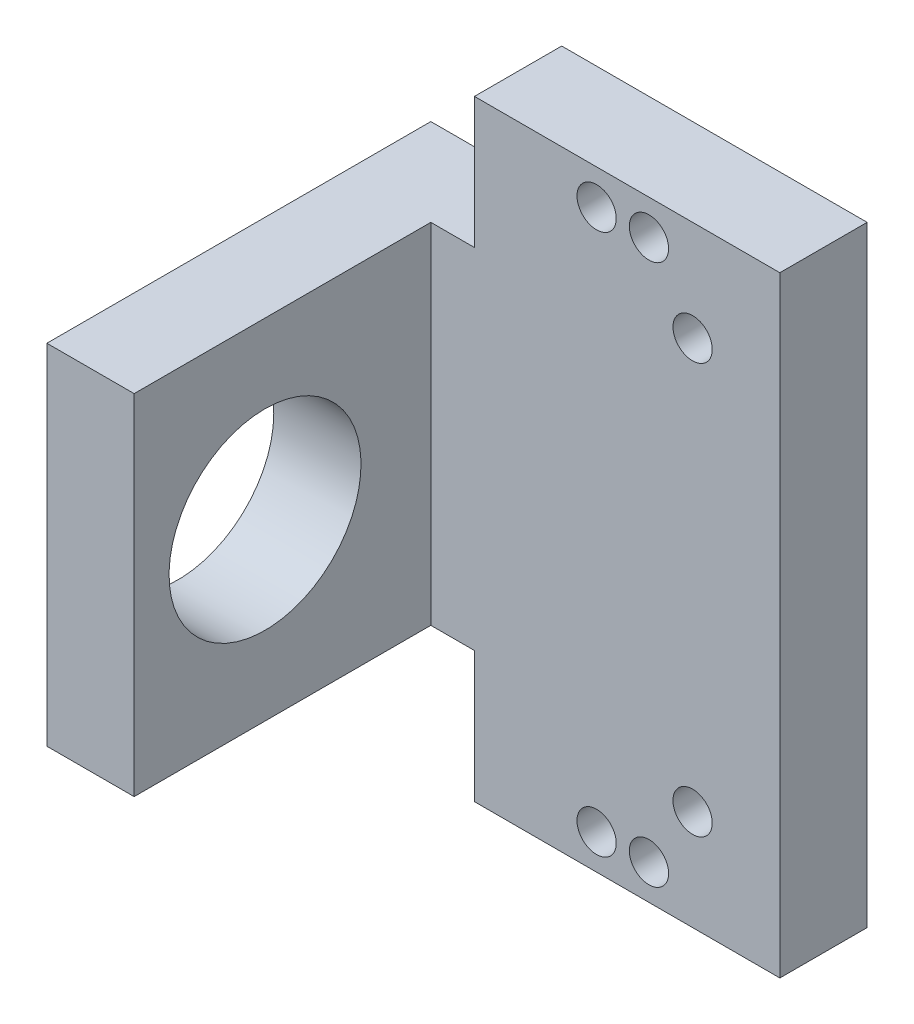
ISO-10303-21;
HEADER;
FILE_DESCRIPTION(('STEP AP214'),'2;1');
FILE_NAME('part.step','',(''),(''),'','','');
FILE_SCHEMA(('AUTOMOTIVE_DESIGN { 1 0 10303 214 1 1 1 1 }'));
ENDSEC;
DATA;
#1=APPLICATION_CONTEXT('core data for automotive mechanical design processes');
#2=APPLICATION_PROTOCOL_DEFINITION('international standard','automotive_design',2000,#1);
#3=PRODUCT_CONTEXT('',#1,'mechanical');
#4=PRODUCT('Part','Part','',(#3));
#5=PRODUCT_RELATED_PRODUCT_CATEGORY('part','',(#4));
#6=PRODUCT_DEFINITION_FORMATION('','',#4);
#7=PRODUCT_DEFINITION_CONTEXT('part definition',#1,'design');
#8=PRODUCT_DEFINITION('design','',#6,#7);
#9=PRODUCT_DEFINITION_SHAPE('','',#8);
#10=(LENGTH_UNIT() NAMED_UNIT(*) SI_UNIT(.MILLI.,.METRE.));
#11=(NAMED_UNIT(*) PLANE_ANGLE_UNIT() SI_UNIT($,.RADIAN.));
#12=(NAMED_UNIT(*) SI_UNIT($,.STERADIAN.) SOLID_ANGLE_UNIT());
#13=UNCERTAINTY_MEASURE_WITH_UNIT(LENGTH_MEASURE(1.E-05),#10,'distance_accuracy_value','');
#14=(GEOMETRIC_REPRESENTATION_CONTEXT(3) GLOBAL_UNCERTAINTY_ASSIGNED_CONTEXT((#13)) GLOBAL_UNIT_ASSIGNED_CONTEXT((#10,
#11,#12)) REPRESENTATION_CONTEXT('',''));
#15=CARTESIAN_POINT('',(0.,0.,0.));
#16=DIRECTION('',(0.,0.,1.));
#17=DIRECTION('',(1.,0.,0.));
#18=AXIS2_PLACEMENT_3D('',#15,#16,#17);
#19=CARTESIAN_POINT('',(0.,70.,10.));
#20=DIRECTION('',(0.,0.,-1.));
#21=DIRECTION('',(-1.,0.,0.));
#22=AXIS2_PLACEMENT_3D('',#19,#20,#21);
#23=PLANE('',#22);
#24=CARTESIAN_POINT('',(29.,66.,10.));
#25=DIRECTION('',(0.,0.,1.));
#26=DIRECTION('',(-1.,0.,0.));
#27=AXIS2_PLACEMENT_3D('',#24,#25,#26);
#28=CIRCLE('',#27,2.25);
#29=CARTESIAN_POINT('',(26.75,66.,10.));
#30=VERTEX_POINT('',#29);
#31=EDGE_CURVE('E168',#30,#30,#28,.T.);
#32=ORIENTED_EDGE('',*,*,#31,.F.);
#33=EDGE_LOOP('',(#32));
#34=FACE_BOUND('',#33,.T.);
#35=CARTESIAN_POINT('',(29.,4.,10.));
#36=DIRECTION('',(0.,0.,1.));
#37=DIRECTION('',(1.,0.,0.));
#38=AXIS2_PLACEMENT_3D('',#35,#36,#37);
#39=CIRCLE('',#38,2.25);
#40=CARTESIAN_POINT('',(31.25,4.,10.));
#41=VERTEX_POINT('',#40);
#42=EDGE_CURVE('E172',#41,#41,#39,.T.);
#43=ORIENTED_EDGE('',*,*,#42,.F.);
#44=EDGE_LOOP('',(#43));
#45=FACE_BOUND('',#44,.T.);
#46=CARTESIAN_POINT('',(35.,4.,10.));
#47=DIRECTION('',(0.,0.,1.));
#48=DIRECTION('',(-1.,0.,0.));
#49=AXIS2_PLACEMENT_3D('',#46,#47,#48);
#50=CIRCLE('',#49,2.25);
#51=CARTESIAN_POINT('',(32.75,4.,10.));
#52=VERTEX_POINT('',#51);
#53=EDGE_CURVE('E178',#52,#52,#50,.T.);
#54=ORIENTED_EDGE('',*,*,#53,.F.);
#55=EDGE_LOOP('',(#54));
#56=FACE_BOUND('',#55,.T.);
#57=CARTESIAN_POINT('',(35.,66.,10.));
#58=DIRECTION('',(0.,0.,1.));
#59=DIRECTION('',(1.,0.,0.));
#60=AXIS2_PLACEMENT_3D('',#57,#58,#59);
#61=CIRCLE('',#60,2.25);
#62=CARTESIAN_POINT('',(37.25,66.,10.));
#63=VERTEX_POINT('',#62);
#64=EDGE_CURVE('E184',#63,#63,#61,.T.);
#65=ORIENTED_EDGE('',*,*,#64,.F.);
#66=EDGE_LOOP('',(#65));
#67=FACE_BOUND('',#66,.T.);
#68=CARTESIAN_POINT('',(40.,58.5,10.));
#69=DIRECTION('',(0.,0.,1.));
#70=DIRECTION('',(-1.,0.,0.));
#71=AXIS2_PLACEMENT_3D('',#68,#69,#70);
#72=CIRCLE('',#71,2.25);
#73=CARTESIAN_POINT('',(37.75,58.5,10.));
#74=VERTEX_POINT('',#73);
#75=EDGE_CURVE('E190',#74,#74,#72,.T.);
#76=ORIENTED_EDGE('',*,*,#75,.F.);
#77=EDGE_LOOP('',(#76));
#78=FACE_BOUND('',#77,.T.);
#79=CARTESIAN_POINT('',(40.,11.5,10.));
#80=DIRECTION('',(0.,0.,1.));
#81=DIRECTION('',(1.,0.,0.));
#82=AXIS2_PLACEMENT_3D('',#79,#80,#81);
#83=CIRCLE('',#82,2.25);
#84=CARTESIAN_POINT('',(42.25,11.5,10.));
#85=VERTEX_POINT('',#84);
#86=EDGE_CURVE('E196',#85,#85,#83,.T.);
#87=ORIENTED_EDGE('',*,*,#86,.F.);
#88=EDGE_LOOP('',(#87));
#89=FACE_BOUND('',#88,.T.);
#90=DIRECTION('',(0.,1.,0.));
#91=VECTOR('',#90,1.);
#92=CARTESIAN_POINT('',(15.,55.,10.));
#93=LINE('',#92,#91);
#94=CARTESIAN_POINT('',(15.,55.,10.));
#95=VERTEX_POINT('',#94);
#96=CARTESIAN_POINT('',(15.,70.,10.));
#97=VERTEX_POINT('',#96);
#98=EDGE_CURVE('E137',#95,#97,#93,.T.);
#99=ORIENTED_EDGE('',*,*,#98,.F.);
#100=DIRECTION('',(1.,0.,0.));
#101=VECTOR('',#100,1.);
#102=CARTESIAN_POINT('',(0.,55.,10.));
#103=LINE('',#102,#101);
#104=CARTESIAN_POINT('',(10.,55.,10.));
#105=VERTEX_POINT('',#104);
#106=EDGE_CURVE('E120',#105,#95,#103,.T.);
#107=ORIENTED_EDGE('',*,*,#106,.F.);
#108=DIRECTION('',(0.,1.,0.));
#109=VECTOR('',#108,1.);
#110=CARTESIAN_POINT('',(10.,70.,10.));
#111=LINE('',#110,#109);
#112=CARTESIAN_POINT('',(10.,15.,10.));
#113=VERTEX_POINT('',#112);
#114=EDGE_CURVE('E210',#113,#105,#111,.T.);
#115=ORIENTED_EDGE('',*,*,#114,.F.);
#116=DIRECTION('',(-1.,0.,0.));
#117=VECTOR('',#116,1.);
#118=CARTESIAN_POINT('',(0.,15.,10.));
#119=LINE('',#118,#117);
#120=CARTESIAN_POINT('',(15.,15.,10.));
#121=VERTEX_POINT('',#120);
#122=EDGE_CURVE('E148',#121,#113,#119,.T.);
#123=ORIENTED_EDGE('',*,*,#122,.F.);
#124=DIRECTION('',(0.,1.,0.));
#125=VECTOR('',#124,1.);
#126=CARTESIAN_POINT('',(15.,15.,10.));
#127=LINE('',#126,#125);
#128=CARTESIAN_POINT('',(15.,0.,10.));
#129=VERTEX_POINT('',#128);
#130=EDGE_CURVE('E142',#129,#121,#127,.T.);
#131=ORIENTED_EDGE('',*,*,#130,.F.);
#132=DIRECTION('',(1.,0.,0.));
#133=VECTOR('',#132,1.);
#134=CARTESIAN_POINT('',(0.,0.,10.));
#135=LINE('',#134,#133);
#136=CARTESIAN_POINT('',(50.,0.,10.));
#137=VERTEX_POINT('',#136);
#138=EDGE_CURVE('E38',#129,#137,#135,.T.);
#139=ORIENTED_EDGE('',*,*,#138,.T.);
#140=DIRECTION('',(0.,1.,0.));
#141=VECTOR('',#140,1.);
#142=CARTESIAN_POINT('',(50.,0.,10.));
#143=LINE('',#142,#141);
#144=CARTESIAN_POINT('',(50.,70.,10.));
#145=VERTEX_POINT('',#144);
#146=EDGE_CURVE('E224',#137,#145,#143,.T.);
#147=ORIENTED_EDGE('',*,*,#146,.T.);
#148=DIRECTION('',(-1.,0.,0.));
#149=VECTOR('',#148,1.);
#150=CARTESIAN_POINT('',(0.,70.,10.));
#151=LINE('',#150,#149);
#152=EDGE_CURVE('E221',#145,#97,#151,.T.);
#153=ORIENTED_EDGE('',*,*,#152,.T.);
#154=EDGE_LOOP('',(#99,#107,#115,#123,#131,#139,#147,#153));
#155=FACE_BOUND('',#154,.T.);
#156=ADVANCED_FACE('F34',(#34,#45,#56,#67,#78,#89,#155),#23,.F.);
#157=CARTESIAN_POINT('',(0.,0.,10.));
#158=DIRECTION('',(1.,0.,0.));
#159=DIRECTION('',(0.,0.,-1.));
#160=AXIS2_PLACEMENT_3D('',#157,#158,#159);
#161=PLANE('',#160);
#162=CARTESIAN_POINT('',(0.,35.,29.));
#163=DIRECTION('',(1.,0.,0.));
#164=DIRECTION('',(0.,0.,-1.));
#165=AXIS2_PLACEMENT_3D('',#162,#163,#164);
#166=CIRCLE('',#165,11.);
#167=CARTESIAN_POINT('',(0.,35.,18.));
#168=VERTEX_POINT('',#167);
#169=EDGE_CURVE('E207',#168,#168,#166,.T.);
#170=ORIENTED_EDGE('',*,*,#169,.T.);
#171=EDGE_LOOP('',(#170));
#172=FACE_BOUND('',#171,.T.);
#173=DIRECTION('',(0.,0.,-1.));
#174=VECTOR('',#173,1.);
#175=CARTESIAN_POINT('',(0.,55.,44.));
#176=LINE('',#175,#174);
#177=CARTESIAN_POINT('',(0.,55.,44.));
#178=VERTEX_POINT('',#177);
#179=CARTESIAN_POINT('',(0.,55.,0.));
#180=VERTEX_POINT('',#179);
#181=EDGE_CURVE('E52',#178,#180,#176,.T.);
#182=ORIENTED_EDGE('',*,*,#181,.T.);
#183=DIRECTION('',(0.,-1.,0.));
#184=VECTOR('',#183,1.);
#185=CARTESIAN_POINT('',(0.,0.,0.));
#186=LINE('',#185,#184);
#187=CARTESIAN_POINT('',(0.,15.,0.));
#188=VERTEX_POINT('',#187);
#189=EDGE_CURVE('E136',#180,#188,#186,.T.);
#190=ORIENTED_EDGE('',*,*,#189,.T.);
#191=DIRECTION('',(0.,0.,1.));
#192=VECTOR('',#191,1.);
#193=CARTESIAN_POINT('',(0.,15.,44.));
#194=LINE('',#193,#192);
#195=CARTESIAN_POINT('',(0.,15.,44.));
#196=VERTEX_POINT('',#195);
#197=EDGE_CURVE('E162',#188,#196,#194,.T.);
#198=ORIENTED_EDGE('',*,*,#197,.T.);
#199=DIRECTION('',(0.,-1.,0.));
#200=VECTOR('',#199,1.);
#201=CARTESIAN_POINT('',(0.,70.,44.));
#202=LINE('',#201,#200);
#203=EDGE_CURVE('E211',#178,#196,#202,.T.);
#204=ORIENTED_EDGE('',*,*,#203,.F.);
#205=EDGE_LOOP('',(#182,#190,#198,#204));
#206=FACE_BOUND('',#205,.T.);
#207=ADVANCED_FACE('F36',(#172,#206),#161,.F.);
#208=CARTESIAN_POINT('',(0.,0.,10.));
#209=DIRECTION('',(0.,1.,0.));
#210=DIRECTION('',(0.,0.,1.));
#211=AXIS2_PLACEMENT_3D('',#208,#209,#210);
#212=PLANE('',#211);
#213=ORIENTED_EDGE('',*,*,#138,.F.);
#214=DIRECTION('',(0.,0.,1.));
#215=VECTOR('',#214,1.);
#216=CARTESIAN_POINT('',(15.,0.,0.));
#217=LINE('',#216,#215);
#218=CARTESIAN_POINT('',(15.,0.,0.));
#219=VERTEX_POINT('',#218);
#220=EDGE_CURVE('E150',#219,#129,#217,.T.);
#221=ORIENTED_EDGE('',*,*,#220,.F.);
#222=DIRECTION('',(1.,0.,0.));
#223=VECTOR('',#222,1.);
#224=CARTESIAN_POINT('',(0.,0.,0.));
#225=LINE('',#224,#223);
#226=CARTESIAN_POINT('',(50.,0.,0.));
#227=VERTEX_POINT('',#226);
#228=EDGE_CURVE('E229',#219,#227,#225,.T.);
#229=ORIENTED_EDGE('',*,*,#228,.T.);
#230=DIRECTION('',(0.,0.,-1.));
#231=VECTOR('',#230,1.);
#232=CARTESIAN_POINT('',(50.,0.,10.));
#233=LINE('',#232,#231);
#234=EDGE_CURVE('E11',#137,#227,#233,.T.);
#235=ORIENTED_EDGE('',*,*,#234,.F.);
#236=EDGE_LOOP('',(#213,#221,#229,#235));
#237=FACE_BOUND('',#236,.T.);
#238=ADVANCED_FACE('F247',(#237),#212,.F.);
#239=CARTESIAN_POINT('',(50.,0.,10.));
#240=DIRECTION('',(-1.,0.,0.));
#241=DIRECTION('',(0.,0.,1.));
#242=AXIS2_PLACEMENT_3D('',#239,#240,#241);
#243=PLANE('',#242);
#244=DIRECTION('',(0.,1.,0.));
#245=VECTOR('',#244,1.);
#246=CARTESIAN_POINT('',(50.,0.,0.));
#247=LINE('',#246,#245);
#248=CARTESIAN_POINT('',(50.,70.,0.));
#249=VERTEX_POINT('',#248);
#250=EDGE_CURVE('E231',#227,#249,#247,.T.);
#251=ORIENTED_EDGE('',*,*,#250,.T.);
#252=DIRECTION('',(0.,0.,-1.));
#253=VECTOR('',#252,1.);
#254=CARTESIAN_POINT('',(50.,70.,10.));
#255=LINE('',#254,#253);
#256=EDGE_CURVE('E44',#145,#249,#255,.T.);
#257=ORIENTED_EDGE('',*,*,#256,.F.);
#258=ORIENTED_EDGE('',*,*,#146,.F.);
#259=ORIENTED_EDGE('',*,*,#234,.T.);
#260=EDGE_LOOP('',(#251,#257,#258,#259));
#261=FACE_BOUND('',#260,.T.);
#262=ADVANCED_FACE('F243',(#261),#243,.F.);
#263=CARTESIAN_POINT('',(0.,70.,10.));
#264=DIRECTION('',(0.,-1.,0.));
#265=DIRECTION('',(0.,0.,-1.));
#266=AXIS2_PLACEMENT_3D('',#263,#264,#265);
#267=PLANE('',#266);
#268=DIRECTION('',(-1.,0.,0.));
#269=VECTOR('',#268,1.);
#270=CARTESIAN_POINT('',(0.,70.,0.));
#271=LINE('',#270,#269);
#272=CARTESIAN_POINT('',(15.,70.,0.));
#273=VERTEX_POINT('',#272);
#274=EDGE_CURVE('E233',#249,#273,#271,.T.);
#275=ORIENTED_EDGE('',*,*,#274,.T.);
#276=DIRECTION('',(0.,0.,1.));
#277=VECTOR('',#276,1.);
#278=CARTESIAN_POINT('',(15.,70.,0.));
#279=LINE('',#278,#277);
#280=EDGE_CURVE('E123',#273,#97,#279,.T.);
#281=ORIENTED_EDGE('',*,*,#280,.T.);
#282=ORIENTED_EDGE('',*,*,#152,.F.);
#283=ORIENTED_EDGE('',*,*,#256,.T.);
#284=EDGE_LOOP('',(#275,#281,#282,#283));
#285=FACE_BOUND('',#284,.T.);
#286=ADVANCED_FACE('F238',(#285),#267,.F.);
#287=CARTESIAN_POINT('',(0.,70.,0.));
#288=DIRECTION('',(0.,0.,-1.));
#289=DIRECTION('',(-1.,0.,0.));
#290=AXIS2_PLACEMENT_3D('',#287,#288,#289);
#291=PLANE('',#290);
#292=DIRECTION('',(1.,0.,0.));
#293=VECTOR('',#292,1.);
#294=CARTESIAN_POINT('',(0.,55.,0.));
#295=LINE('',#294,#293);
#296=CARTESIAN_POINT('',(15.,55.,0.));
#297=VERTEX_POINT('',#296);
#298=EDGE_CURVE('E118',#180,#297,#295,.T.);
#299=ORIENTED_EDGE('',*,*,#298,.T.);
#300=DIRECTION('',(0.,1.,0.));
#301=VECTOR('',#300,1.);
#302=CARTESIAN_POINT('',(15.,55.,0.));
#303=LINE('',#302,#301);
#304=EDGE_CURVE('E124',#297,#273,#303,.T.);
#305=ORIENTED_EDGE('',*,*,#304,.T.);
#306=ORIENTED_EDGE('',*,*,#274,.F.);
#307=ORIENTED_EDGE('',*,*,#250,.F.);
#308=ORIENTED_EDGE('',*,*,#228,.F.);
#309=DIRECTION('',(0.,1.,0.));
#310=VECTOR('',#309,1.);
#311=CARTESIAN_POINT('',(15.,15.,0.));
#312=LINE('',#311,#310);
#313=CARTESIAN_POINT('',(15.,15.,0.));
#314=VERTEX_POINT('',#313);
#315=EDGE_CURVE('E144',#219,#314,#312,.T.);
#316=ORIENTED_EDGE('',*,*,#315,.T.);
#317=DIRECTION('',(-1.,0.,0.));
#318=VECTOR('',#317,1.);
#319=CARTESIAN_POINT('',(0.,15.,0.));
#320=LINE('',#319,#318);
#321=EDGE_CURVE('E147',#314,#188,#320,.T.);
#322=ORIENTED_EDGE('',*,*,#321,.T.);
#323=ORIENTED_EDGE('',*,*,#189,.F.);
#324=EDGE_LOOP('',(#299,#305,#306,#307,#308,#316,#322,#323));
#325=FACE_BOUND('',#324,.T.);
#326=CARTESIAN_POINT('',(29.,66.,0.));
#327=DIRECTION('',(0.,0.,1.));
#328=DIRECTION('',(-1.,0.,0.));
#329=AXIS2_PLACEMENT_3D('',#326,#327,#328);
#330=CIRCLE('',#329,2.25);
#331=CARTESIAN_POINT('',(26.75,66.,0.));
#332=VERTEX_POINT('',#331);
#333=EDGE_CURVE('E169',#332,#332,#330,.T.);
#334=ORIENTED_EDGE('',*,*,#333,.T.);
#335=EDGE_LOOP('',(#334));
#336=FACE_BOUND('',#335,.T.);
#337=CARTESIAN_POINT('',(29.,4.,0.));
#338=DIRECTION('',(0.,0.,1.));
#339=DIRECTION('',(1.,0.,0.));
#340=AXIS2_PLACEMENT_3D('',#337,#338,#339);
#341=CIRCLE('',#340,2.25);
#342=CARTESIAN_POINT('',(31.25,4.,0.));
#343=VERTEX_POINT('',#342);
#344=EDGE_CURVE('E175',#343,#343,#341,.T.);
#345=ORIENTED_EDGE('',*,*,#344,.T.);
#346=EDGE_LOOP('',(#345));
#347=FACE_BOUND('',#346,.T.);
#348=CARTESIAN_POINT('',(35.,4.,0.));
#349=DIRECTION('',(0.,0.,1.));
#350=DIRECTION('',(-1.,0.,0.));
#351=AXIS2_PLACEMENT_3D('',#348,#349,#350);
#352=CIRCLE('',#351,2.25);
#353=CARTESIAN_POINT('',(32.75,4.,0.));
#354=VERTEX_POINT('',#353);
#355=EDGE_CURVE('E181',#354,#354,#352,.T.);
#356=ORIENTED_EDGE('',*,*,#355,.T.);
#357=EDGE_LOOP('',(#356));
#358=FACE_BOUND('',#357,.T.);
#359=CARTESIAN_POINT('',(35.,66.,0.));
#360=DIRECTION('',(0.,0.,1.));
#361=DIRECTION('',(1.,0.,0.));
#362=AXIS2_PLACEMENT_3D('',#359,#360,#361);
#363=CIRCLE('',#362,2.25);
#364=CARTESIAN_POINT('',(37.25,66.,0.));
#365=VERTEX_POINT('',#364);
#366=EDGE_CURVE('E187',#365,#365,#363,.T.);
#367=ORIENTED_EDGE('',*,*,#366,.T.);
#368=EDGE_LOOP('',(#367));
#369=FACE_BOUND('',#368,.T.);
#370=CARTESIAN_POINT('',(40.,58.5,0.));
#371=DIRECTION('',(0.,0.,1.));
#372=DIRECTION('',(-1.,0.,0.));
#373=AXIS2_PLACEMENT_3D('',#370,#371,#372);
#374=CIRCLE('',#373,2.25);
#375=CARTESIAN_POINT('',(37.75,58.5,0.));
#376=VERTEX_POINT('',#375);
#377=EDGE_CURVE('E193',#376,#376,#374,.T.);
#378=ORIENTED_EDGE('',*,*,#377,.T.);
#379=EDGE_LOOP('',(#378));
#380=FACE_BOUND('',#379,.T.);
#381=CARTESIAN_POINT('',(40.,11.5,0.));
#382=DIRECTION('',(0.,0.,1.));
#383=DIRECTION('',(1.,0.,0.));
#384=AXIS2_PLACEMENT_3D('',#381,#382,#383);
#385=CIRCLE('',#384,2.25);
#386=CARTESIAN_POINT('',(42.25,11.5,0.));
#387=VERTEX_POINT('',#386);
#388=EDGE_CURVE('E199',#387,#387,#385,.T.);
#389=ORIENTED_EDGE('',*,*,#388,.T.);
#390=EDGE_LOOP('',(#389));
#391=FACE_BOUND('',#390,.T.);
#392=ADVANCED_FACE('F133',(#325,#336,#347,#358,#369,#380,#391),#291,.T.);
#393=CARTESIAN_POINT('',(10.,70.,44.));
#394=DIRECTION('',(-1.,0.,0.));
#395=DIRECTION('',(0.,-1.,0.));
#396=AXIS2_PLACEMENT_3D('',#393,#394,#395);
#397=PLANE('',#396);
#398=CARTESIAN_POINT('',(10.,35.,29.));
#399=DIRECTION('',(1.,0.,0.));
#400=DIRECTION('',(0.,1.,0.));
#401=AXIS2_PLACEMENT_3D('',#398,#399,#400);
#402=CIRCLE('',#401,11.);
#403=CARTESIAN_POINT('',(10.,46.,29.));
#404=VERTEX_POINT('',#403);
#405=EDGE_CURVE('E202',#404,#404,#402,.T.);
#406=ORIENTED_EDGE('',*,*,#405,.F.);
#407=EDGE_LOOP('',(#406));
#408=FACE_BOUND('',#407,.T.);
#409=ORIENTED_EDGE('',*,*,#114,.T.);
#410=DIRECTION('',(0.,0.,-1.));
#411=VECTOR('',#410,1.);
#412=CARTESIAN_POINT('',(10.,55.,44.));
#413=LINE('',#412,#411);
#414=CARTESIAN_POINT('',(10.,55.,44.));
#415=VERTEX_POINT('',#414);
#416=EDGE_CURVE('E156',#415,#105,#413,.T.);
#417=ORIENTED_EDGE('',*,*,#416,.F.);
#418=DIRECTION('',(0.,1.,0.));
#419=VECTOR('',#418,1.);
#420=CARTESIAN_POINT('',(10.,70.,44.));
#421=LINE('',#420,#419);
#422=CARTESIAN_POINT('',(10.,15.,44.));
#423=VERTEX_POINT('',#422);
#424=EDGE_CURVE('E213',#423,#415,#421,.T.);
#425=ORIENTED_EDGE('',*,*,#424,.F.);
#426=DIRECTION('',(0.,0.,1.));
#427=VECTOR('',#426,1.);
#428=CARTESIAN_POINT('',(10.,15.,44.));
#429=LINE('',#428,#427);
#430=EDGE_CURVE('E60',#113,#423,#429,.T.);
#431=ORIENTED_EDGE('',*,*,#430,.F.);
#432=EDGE_LOOP('',(#409,#417,#425,#431));
#433=FACE_BOUND('',#432,.T.);
#434=ADVANCED_FACE('F259',(#408,#433),#397,.F.);
#435=CARTESIAN_POINT('',(0.,0.,44.));
#436=DIRECTION('',(0.,0.,1.));
#437=DIRECTION('',(1.,0.,0.));
#438=AXIS2_PLACEMENT_3D('',#435,#436,#437);
#439=PLANE('',#438);
#440=DIRECTION('',(1.,0.,0.));
#441=VECTOR('',#440,1.);
#442=CARTESIAN_POINT('',(0.,55.,44.));
#443=LINE('',#442,#441);
#444=EDGE_CURVE('E159',#178,#415,#443,.T.);
#445=ORIENTED_EDGE('',*,*,#444,.F.);
#446=ORIENTED_EDGE('',*,*,#203,.T.);
#447=DIRECTION('',(1.,0.,0.));
#448=VECTOR('',#447,1.);
#449=CARTESIAN_POINT('',(0.,15.,44.));
#450=LINE('',#449,#448);
#451=EDGE_CURVE('E165',#196,#423,#450,.T.);
#452=ORIENTED_EDGE('',*,*,#451,.T.);
#453=ORIENTED_EDGE('',*,*,#424,.T.);
#454=EDGE_LOOP('',(#445,#446,#452,#453));
#455=FACE_BOUND('',#454,.T.);
#456=ADVANCED_FACE('F262',(#455),#439,.T.);
#457=CARTESIAN_POINT('',(-22.,35.,29.));
#458=DIRECTION('',(1.,0.,0.));
#459=DIRECTION('',(0.,1.,0.));
#460=AXIS2_PLACEMENT_3D('',#457,#458,#459);
#461=CYLINDRICAL_SURFACE('',#460,11.);
#462=ORIENTED_EDGE('',*,*,#405,.T.);
#463=EDGE_LOOP('',(#462));
#464=FACE_BOUND('',#463,.T.);
#465=ORIENTED_EDGE('',*,*,#169,.F.);
#466=EDGE_LOOP('',(#465));
#467=FACE_BOUND('',#466,.T.);
#468=ADVANCED_FACE('F277',(#464,#467),#461,.F.);
#469=CARTESIAN_POINT('',(40.,11.5,0.));
#470=DIRECTION('',(0.,0.,1.));
#471=DIRECTION('',(1.,0.,0.));
#472=AXIS2_PLACEMENT_3D('',#469,#470,#471);
#473=CYLINDRICAL_SURFACE('',#472,2.25);
#474=ORIENTED_EDGE('',*,*,#388,.F.);
#475=EDGE_LOOP('',(#474));
#476=FACE_BOUND('',#475,.T.);
#477=ORIENTED_EDGE('',*,*,#86,.T.);
#478=EDGE_LOOP('',(#477));
#479=FACE_BOUND('',#478,.T.);
#480=ADVANCED_FACE('F279',(#476,#479),#473,.F.);
#481=CARTESIAN_POINT('',(40.,58.5,0.));
#482=DIRECTION('',(0.,0.,1.));
#483=DIRECTION('',(1.,0.,0.));
#484=AXIS2_PLACEMENT_3D('',#481,#482,#483);
#485=CYLINDRICAL_SURFACE('',#484,2.25);
#486=ORIENTED_EDGE('',*,*,#377,.F.);
#487=EDGE_LOOP('',(#486));
#488=FACE_BOUND('',#487,.T.);
#489=ORIENTED_EDGE('',*,*,#75,.T.);
#490=EDGE_LOOP('',(#489));
#491=FACE_BOUND('',#490,.T.);
#492=ADVANCED_FACE('F286',(#488,#491),#485,.F.);
#493=CARTESIAN_POINT('',(35.,66.,0.));
#494=DIRECTION('',(0.,0.,1.));
#495=DIRECTION('',(1.,0.,0.));
#496=AXIS2_PLACEMENT_3D('',#493,#494,#495);
#497=CYLINDRICAL_SURFACE('',#496,2.25);
#498=ORIENTED_EDGE('',*,*,#366,.F.);
#499=EDGE_LOOP('',(#498));
#500=FACE_BOUND('',#499,.T.);
#501=ORIENTED_EDGE('',*,*,#64,.T.);
#502=EDGE_LOOP('',(#501));
#503=FACE_BOUND('',#502,.T.);
#504=ADVANCED_FACE('F395',(#500,#503),#497,.F.);
#505=CARTESIAN_POINT('',(35.,4.,0.));
#506=DIRECTION('',(0.,0.,1.));
#507=DIRECTION('',(1.,0.,0.));
#508=AXIS2_PLACEMENT_3D('',#505,#506,#507);
#509=CYLINDRICAL_SURFACE('',#508,2.25);
#510=ORIENTED_EDGE('',*,*,#355,.F.);
#511=EDGE_LOOP('',(#510));
#512=FACE_BOUND('',#511,.T.);
#513=ORIENTED_EDGE('',*,*,#53,.T.);
#514=EDGE_LOOP('',(#513));
#515=FACE_BOUND('',#514,.T.);
#516=ADVANCED_FACE('F391',(#512,#515),#509,.F.);
#517=CARTESIAN_POINT('',(29.,4.,0.));
#518=DIRECTION('',(0.,0.,1.));
#519=DIRECTION('',(1.,0.,0.));
#520=AXIS2_PLACEMENT_3D('',#517,#518,#519);
#521=CYLINDRICAL_SURFACE('',#520,2.25);
#522=ORIENTED_EDGE('',*,*,#344,.F.);
#523=EDGE_LOOP('',(#522));
#524=FACE_BOUND('',#523,.T.);
#525=ORIENTED_EDGE('',*,*,#42,.T.);
#526=EDGE_LOOP('',(#525));
#527=FACE_BOUND('',#526,.T.);
#528=ADVANCED_FACE('F388',(#524,#527),#521,.F.);
#529=CARTESIAN_POINT('',(29.,66.,0.));
#530=DIRECTION('',(0.,0.,1.));
#531=DIRECTION('',(1.,0.,0.));
#532=AXIS2_PLACEMENT_3D('',#529,#530,#531);
#533=CYLINDRICAL_SURFACE('',#532,2.25);
#534=ORIENTED_EDGE('',*,*,#333,.F.);
#535=EDGE_LOOP('',(#534));
#536=FACE_BOUND('',#535,.T.);
#537=ORIENTED_EDGE('',*,*,#31,.T.);
#538=EDGE_LOOP('',(#537));
#539=FACE_BOUND('',#538,.T.);
#540=ADVANCED_FACE('F336',(#536,#539),#533,.F.);
#541=CARTESIAN_POINT('',(0.,15.,44.));
#542=DIRECTION('',(0.,1.,0.));
#543=DIRECTION('',(-1.,0.,0.));
#544=AXIS2_PLACEMENT_3D('',#541,#542,#543);
#545=PLANE('',#544);
#546=ORIENTED_EDGE('',*,*,#430,.T.);
#547=ORIENTED_EDGE('',*,*,#451,.F.);
#548=ORIENTED_EDGE('',*,*,#197,.F.);
#549=ORIENTED_EDGE('',*,*,#321,.F.);
#550=DIRECTION('',(0.,0.,1.));
#551=VECTOR('',#550,1.);
#552=CARTESIAN_POINT('',(15.,15.,0.));
#553=LINE('',#552,#551);
#554=EDGE_CURVE('E154',#314,#121,#553,.T.);
#555=ORIENTED_EDGE('',*,*,#554,.T.);
#556=ORIENTED_EDGE('',*,*,#122,.T.);
#557=EDGE_LOOP('',(#546,#547,#548,#549,#555,#556));
#558=FACE_BOUND('',#557,.T.);
#559=ADVANCED_FACE('F255',(#558),#545,.F.);
#560=CARTESIAN_POINT('',(0.,55.,44.));
#561=DIRECTION('',(0.,-1.,0.));
#562=DIRECTION('',(1.,0.,0.));
#563=AXIS2_PLACEMENT_3D('',#560,#561,#562);
#564=PLANE('',#563);
#565=ORIENTED_EDGE('',*,*,#416,.T.);
#566=ORIENTED_EDGE('',*,*,#106,.T.);
#567=DIRECTION('',(0.,0.,1.));
#568=VECTOR('',#567,1.);
#569=CARTESIAN_POINT('',(15.,55.,0.));
#570=LINE('',#569,#568);
#571=EDGE_CURVE('E113',#297,#95,#570,.T.);
#572=ORIENTED_EDGE('',*,*,#571,.F.);
#573=ORIENTED_EDGE('',*,*,#298,.F.);
#574=ORIENTED_EDGE('',*,*,#181,.F.);
#575=ORIENTED_EDGE('',*,*,#444,.T.);
#576=EDGE_LOOP('',(#565,#566,#572,#573,#574,#575));
#577=FACE_BOUND('',#576,.T.);
#578=ADVANCED_FACE('F116',(#577),#564,.F.);
#579=CARTESIAN_POINT('',(15.,15.,0.));
#580=DIRECTION('',(1.,0.,0.));
#581=DIRECTION('',(0.,1.,0.));
#582=AXIS2_PLACEMENT_3D('',#579,#580,#581);
#583=PLANE('',#582);
#584=ORIENTED_EDGE('',*,*,#130,.T.);
#585=ORIENTED_EDGE('',*,*,#554,.F.);
#586=ORIENTED_EDGE('',*,*,#315,.F.);
#587=ORIENTED_EDGE('',*,*,#220,.T.);
#588=EDGE_LOOP('',(#584,#585,#586,#587));
#589=FACE_BOUND('',#588,.T.);
#590=ADVANCED_FACE('F251',(#589),#583,.F.);
#591=CARTESIAN_POINT('',(15.,55.,0.));
#592=DIRECTION('',(1.,0.,0.));
#593=DIRECTION('',(0.,1.,0.));
#594=AXIS2_PLACEMENT_3D('',#591,#592,#593);
#595=PLANE('',#594);
#596=ORIENTED_EDGE('',*,*,#98,.T.);
#597=ORIENTED_EDGE('',*,*,#280,.F.);
#598=ORIENTED_EDGE('',*,*,#304,.F.);
#599=ORIENTED_EDGE('',*,*,#571,.T.);
#600=EDGE_LOOP('',(#596,#597,#598,#599));
#601=FACE_BOUND('',#600,.T.);
#602=ADVANCED_FACE('F127',(#601),#595,.F.);
#603=CLOSED_SHELL('',(#156,#207,#238,#262,#286,#392,#434,#456,#468,#480,#492,#504,#516,#528,
#540,#559,#578,#590,#602));
#604=MANIFOLD_SOLID_BREP('B2',#603);
#605=ADVANCED_BREP_SHAPE_REPRESENTATION('',(#18,#604),#14);
#606=SHAPE_DEFINITION_REPRESENTATION(#9,#605);
ENDSEC;
END-ISO-10303-21;
